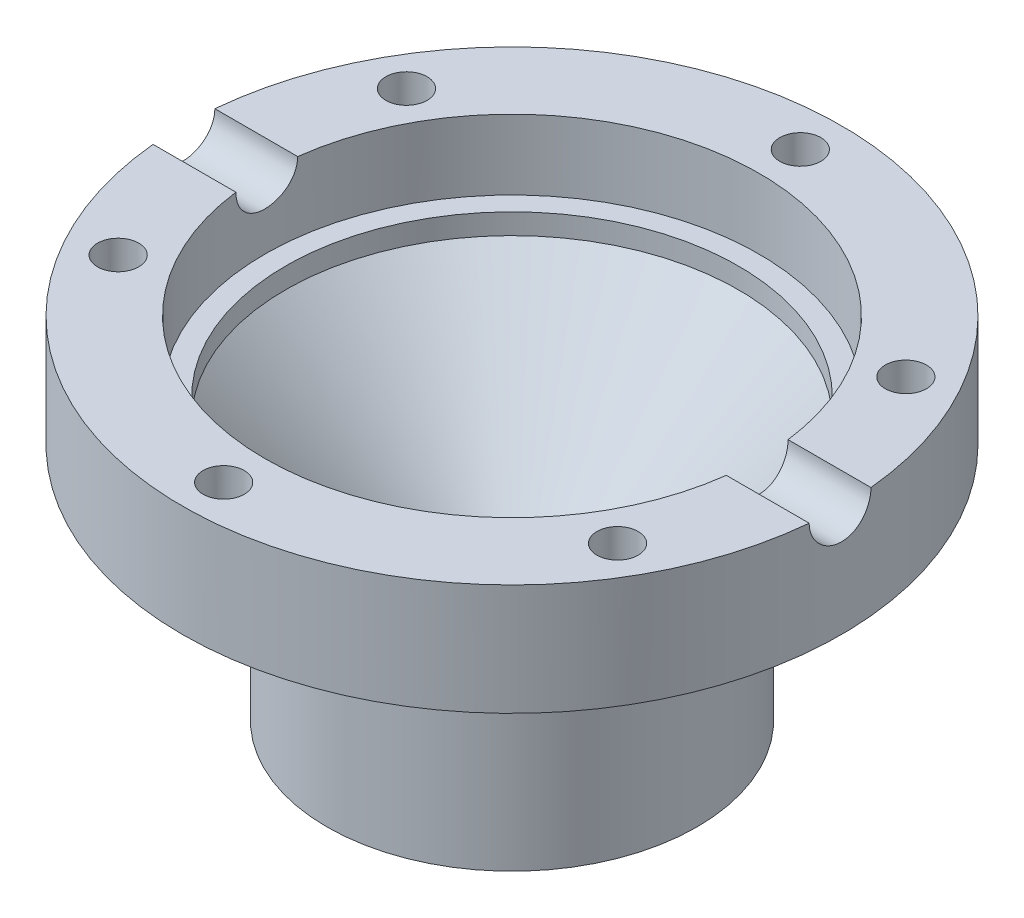
ISO-10303-21;
HEADER;
FILE_DESCRIPTION(('STEP AP214'),'2;1');
FILE_NAME('part.step','',(''),(''),'','','');
FILE_SCHEMA(('AUTOMOTIVE_DESIGN { 1 0 10303 214 1 1 1 1 }'));
ENDSEC;
DATA;
#1=APPLICATION_CONTEXT('core data for automotive mechanical design processes');
#2=APPLICATION_PROTOCOL_DEFINITION('international standard','automotive_design',2000,#1);
#3=PRODUCT_CONTEXT('',#1,'mechanical');
#4=PRODUCT('Part','Part','',(#3));
#5=PRODUCT_RELATED_PRODUCT_CATEGORY('part','',(#4));
#6=PRODUCT_DEFINITION_FORMATION('','',#4);
#7=PRODUCT_DEFINITION_CONTEXT('part definition',#1,'design');
#8=PRODUCT_DEFINITION('design','',#6,#7);
#9=PRODUCT_DEFINITION_SHAPE('','',#8);
#10=(LENGTH_UNIT() NAMED_UNIT(*) SI_UNIT(.MILLI.,.METRE.));
#11=(NAMED_UNIT(*) PLANE_ANGLE_UNIT() SI_UNIT($,.RADIAN.));
#12=(NAMED_UNIT(*) SI_UNIT($,.STERADIAN.) SOLID_ANGLE_UNIT());
#13=UNCERTAINTY_MEASURE_WITH_UNIT(LENGTH_MEASURE(1.E-05),#10,'distance_accuracy_value','');
#14=(GEOMETRIC_REPRESENTATION_CONTEXT(3) GLOBAL_UNCERTAINTY_ASSIGNED_CONTEXT((#13)) GLOBAL_UNIT_ASSIGNED_CONTEXT((#10,
#11,#12)) REPRESENTATION_CONTEXT('',''));
#15=CARTESIAN_POINT('',(0.,0.,0.));
#16=DIRECTION('',(0.,0.,1.));
#17=DIRECTION('',(1.,0.,0.));
#18=AXIS2_PLACEMENT_3D('',#15,#16,#17);
#19=CARTESIAN_POINT('',(0.,21.59,0.));
#20=DIRECTION('',(0.,1.,0.));
#21=DIRECTION('',(0.,0.,1.));
#22=AXIS2_PLACEMENT_3D('',#19,#20,#21);
#23=PLANE('',#22);
#24=DIRECTION('',(1.,0.,0.));
#25=VECTOR('',#24,1.);
#26=CARTESIAN_POINT('',(-20.32,21.59,1.905));
#27=LINE('',#26,#25);
#28=CARTESIAN_POINT('',(-20.230506049034,21.59,1.905));
#29=VERTEX_POINT('',#28);
#30=CARTESIAN_POINT('',(-15.1204687427341,21.59,1.905));
#31=VERTEX_POINT('',#30);
#32=EDGE_CURVE('E55',#29,#31,#27,.T.);
#33=ORIENTED_EDGE('',*,*,#32,.F.);
#34=CARTESIAN_POINT('',(0.,21.59,0.));
#35=DIRECTION('',(0.,1.,0.));
#36=DIRECTION('',(0.,0.,1.));
#37=AXIS2_PLACEMENT_3D('',#34,#35,#36);
#38=CIRCLE('',#37,20.32);
#39=CARTESIAN_POINT('',(20.230506049034,21.59,1.905));
#40=VERTEX_POINT('',#39);
#41=EDGE_CURVE('E99',#29,#40,#38,.T.);
#42=ORIENTED_EDGE('',*,*,#41,.T.);
#43=CARTESIAN_POINT('',(15.1204687427341,21.59,1.905));
#44=VERTEX_POINT('',#43);
#45=EDGE_CURVE('E137',#44,#40,#27,.T.);
#46=ORIENTED_EDGE('',*,*,#45,.F.);
#47=CARTESIAN_POINT('',(0.,21.59,0.));
#48=DIRECTION('',(0.,1.,0.));
#49=DIRECTION('',(0.,0.,1.));
#50=AXIS2_PLACEMENT_3D('',#47,#48,#49);
#51=CIRCLE('',#50,15.24);
#52=EDGE_CURVE('E96',#31,#44,#51,.T.);
#53=ORIENTED_EDGE('',*,*,#52,.F.);
#54=EDGE_LOOP('',(#33,#42,#46,#53));
#55=FACE_BOUND('',#54,.T.);
#56=CARTESIAN_POINT('',(15.3979316792873,21.59,8.89000000000007));
#57=DIRECTION('',(0.,1.,0.));
#58=DIRECTION('',(-0.866025403784436,0.,-0.500000000000004));
#59=AXIS2_PLACEMENT_3D('',#56,#57,#58);
#60=CIRCLE('',#59,1.27);
#61=CARTESIAN_POINT('',(14.298079416481,21.59,8.25500000000007));
#62=VERTEX_POINT('',#61);
#63=EDGE_CURVE('E159',#62,#62,#60,.T.);
#64=ORIENTED_EDGE('',*,*,#63,.F.);
#65=EDGE_LOOP('',(#64));
#66=FACE_BOUND('',#65,.T.);
#67=CARTESIAN_POINT('',(0.,21.59,17.78));
#68=DIRECTION('',(0.,1.,0.));
#69=DIRECTION('',(0.,0.,-1.));
#70=AXIS2_PLACEMENT_3D('',#67,#68,#69);
#71=CIRCLE('',#70,1.27);
#72=CARTESIAN_POINT('',(0.,21.59,16.51));
#73=VERTEX_POINT('',#72);
#74=EDGE_CURVE('E167',#73,#73,#71,.T.);
#75=ORIENTED_EDGE('',*,*,#74,.F.);
#76=EDGE_LOOP('',(#75));
#77=FACE_BOUND('',#76,.T.);
#78=CARTESIAN_POINT('',(-15.3979316792874,21.59,8.88999999999985));
#79=DIRECTION('',(0.,1.,0.));
#80=DIRECTION('',(0.866025403784443,0.,-0.499999999999992));
#81=AXIS2_PLACEMENT_3D('',#78,#79,#80);
#82=CIRCLE('',#81,1.27);
#83=CARTESIAN_POINT('',(-14.2980794164812,21.59,8.25499999999986));
#84=VERTEX_POINT('',#83);
#85=EDGE_CURVE('E173',#84,#84,#82,.T.);
#86=ORIENTED_EDGE('',*,*,#85,.F.);
#87=EDGE_LOOP('',(#86));
#88=FACE_BOUND('',#87,.T.);
#89=ADVANCED_FACE('F33',(#55,#66,#77,#88),#23,.T.);
#90=CARTESIAN_POINT('',(0.,0.,0.));
#91=DIRECTION('',(0.,1.,0.));
#92=DIRECTION('',(0.,0.,1.));
#93=AXIS2_PLACEMENT_3D('',#90,#91,#92);
#94=PLANE('',#93);
#95=CARTESIAN_POINT('',(0.,0.,0.));
#96=DIRECTION('',(0.,-1.,0.));
#97=DIRECTION('',(0.,0.,-1.));
#98=AXIS2_PLACEMENT_3D('',#95,#96,#97);
#99=CIRCLE('',#98,4.699);
#100=CARTESIAN_POINT('',(0.,0.,-4.699));
#101=VERTEX_POINT('',#100);
#102=EDGE_CURVE('E155',#101,#101,#99,.T.);
#103=ORIENTED_EDGE('',*,*,#102,.F.);
#104=EDGE_LOOP('',(#103));
#105=FACE_BOUND('',#104,.T.);
#106=CARTESIAN_POINT('',(0.,0.,0.));
#107=DIRECTION('',(0.,1.,0.));
#108=DIRECTION('',(0.,0.,1.));
#109=AXIS2_PLACEMENT_3D('',#106,#107,#108);
#110=CIRCLE('',#109,11.40968);
#111=CARTESIAN_POINT('',(0.,0.,11.40968));
#112=VERTEX_POINT('',#111);
#113=EDGE_CURVE('E146',#112,#112,#110,.T.);
#114=ORIENTED_EDGE('',*,*,#113,.F.);
#115=EDGE_LOOP('',(#114));
#116=FACE_BOUND('',#115,.T.);
#117=ADVANCED_FACE('F220',(#105,#116),#94,.F.);
#118=CARTESIAN_POINT('',(0.,21.59,0.));
#119=DIRECTION('',(0.,-1.,0.));
#120=DIRECTION('',(0.,0.,-1.));
#121=AXIS2_PLACEMENT_3D('',#118,#119,#120);
#122=CYLINDRICAL_SURFACE('',#121,20.32);
#123=CARTESIAN_POINT('',(0.,14.732,0.));
#124=DIRECTION('',(0.,1.,0.));
#125=DIRECTION('',(0.,0.,1.));
#126=AXIS2_PLACEMENT_3D('',#123,#124,#125);
#127=CIRCLE('',#126,20.32);
#128=CARTESIAN_POINT('',(0.,14.732,20.32));
#129=VERTEX_POINT('',#128);
#130=EDGE_CURVE('E101',#129,#129,#127,.T.);
#131=ORIENTED_EDGE('',*,*,#130,.T.);
#132=EDGE_LOOP('',(#131));
#133=FACE_BOUND('',#132,.T.);
#134=CARTESIAN_POINT('',(20.230506049034,21.59,-1.905));
#135=VERTEX_POINT('',#134);
#136=CARTESIAN_POINT('',(-20.230506049034,21.59,-1.905));
#137=VERTEX_POINT('',#136);
#138=EDGE_CURVE('E86',#135,#137,#38,.T.);
#139=ORIENTED_EDGE('',*,*,#138,.F.);
#140=CARTESIAN_POINT('',(20.230506049034,21.59,-1.905));
#141=CARTESIAN_POINT('',(20.2305048419639,21.536529886188,-1.9049997844618));
#142=CARTESIAN_POINT('',(20.2307183050446,21.4830855041032,-1.9027473617315));
#143=CARTESIAN_POINT('',(20.231561824142,21.3765814709534,-1.89376245028911));
#144=CARTESIAN_POINT('',(20.232191853417,21.3235217954131,-1.88703024915808));
#145=CARTESIAN_POINT('',(20.2346847598082,21.165596507574,-1.86018187930186));
#146=CARTESIAN_POINT('',(20.2371505441765,21.0617924238009,-1.83341374337296));
#147=CARTESIAN_POINT('',(20.2434143344982,20.8601801826428,-1.76289924237057));
#148=CARTESIAN_POINT('',(20.2472128561946,20.7623743637062,-1.71914630381519));
#149=CARTESIAN_POINT('',(20.2557124201876,20.5754921060027,-1.61591652294307));
#150=CARTESIAN_POINT('',(20.2604133454438,20.4864145374543,-1.55644171935339));
#151=CARTESIAN_POINT('',(20.2702044665111,20.3192475841751,-1.42325956423772));
#152=CARTESIAN_POINT('',(20.275295701896,20.2411892368867,-1.34951334578633));
#153=CARTESIAN_POINT('',(20.2852849434553,20.0985286835315,-1.18995465134418));
#154=CARTESIAN_POINT('',(20.2901829201158,20.0339285263536,-1.10414034142077));
#155=CARTESIAN_POINT('',(20.2992435007207,19.9199224956263,-0.922695322511813));
#156=CARTESIAN_POINT('',(20.3034047538332,19.8705444124154,-0.82704707951139));
#157=CARTESIAN_POINT('',(20.3105112772975,19.7885643113934,-0.628777299116423));
#158=CARTESIAN_POINT('',(20.3134566474185,19.7559609170826,-0.526156334673046));
#159=CARTESIAN_POINT('',(20.3177924388191,19.708544192658,-0.317169118568316));
#160=CARTESIAN_POINT('',(20.3191874090494,19.6936788088358,-0.21081477315429));
#161=CARTESIAN_POINT('',(20.320280691444,19.6819989793944,0.00289048637267596));
#162=CARTESIAN_POINT('',(20.3199790011529,19.6851845598983,0.110241401927612));
#163=CARTESIAN_POINT('',(20.3177166277443,19.7094744976171,0.322533435230876));
#164=CARTESIAN_POINT('',(20.3157611751202,19.7305223610124,0.427481080398319));
#165=CARTESIAN_POINT('',(20.310417139208,19.7898513703165,0.632347006443153));
#166=CARTESIAN_POINT('',(20.3070285462902,19.8281326320223,0.73226525352129));
#167=CARTESIAN_POINT('',(20.2991902282816,19.9209049459651,0.924417241106757));
#168=CARTESIAN_POINT('',(20.2947388396777,19.9754214434005,1.01663862581396));
#169=CARTESIAN_POINT('',(20.2852749987263,20.0990958055314,1.19063953581827));
#170=CARTESIAN_POINT('',(20.2802625572437,20.1682533867244,1.2724192632531));
#171=CARTESIAN_POINT('',(20.2702171335259,20.3195536154736,1.42354012541889));
#172=CARTESIAN_POINT('',(20.2651841441853,20.4017435671613,1.49283390216885));
#173=CARTESIAN_POINT('',(20.2556819366046,20.5766461295877,1.61666960669434));
#174=CARTESIAN_POINT('',(20.2512128909555,20.6693619452808,1.67120702420478));
#175=CARTESIAN_POINT('',(20.2433434763916,20.8627316881732,1.76397923375594));
#176=CARTESIAN_POINT('',(20.2399439313991,20.9633916610879,1.80220146494809));
#177=CARTESIAN_POINT('',(20.2346109412246,21.1696641572812,1.86113143952841));
#178=CARTESIAN_POINT('',(20.2326752763653,21.2752689235142,1.88186570539399));
#179=CARTESIAN_POINT('',(20.2312213758828,21.416340356759,1.89738948822792));
#180=CARTESIAN_POINT('',(20.230953293904,21.4510410774768,1.90024485867607));
#181=CARTESIAN_POINT('',(20.2305958533842,21.520489726054,1.90404753411258));
#182=CARTESIAN_POINT('',(20.2305061969765,21.5552374781665,1.90499801916789));
#183=CARTESIAN_POINT('',(20.230506049034,21.59,1.905));
#184=B_SPLINE_CURVE_WITH_KNOTS('',3,(#140,#141,#142,#143,#144,#145,#146,#147,#148,#149,#150,
#151,#152,#153,#154,#155,#156,#157,#158,#159,#160,#161,#162,#163,#164,#165,#166,#167,#168,#169,
#170,#171,#172,#173,#174,#175,#176,#177,#178,#179,#180,#181,#182,#183),.UNSPECIFIED.,.F.,.F.,(4,
2,2,2,2,2,2,2,2,2,2,2,2,2,2,2,2,2,2,2,2,4),(0.,0.16031144516378,0.320612600067446,
0.640645643669809,0.960802670588063,1.28091820160995,1.60191812979215,1.92296689168407,
2.24459835512714,2.56620342187747,2.88686237159023,3.20752178535595,3.52717079906967,
3.846821960646,4.16697676631038,4.48712537322918,4.80846382175077,5.1299003763531,
5.45158395635061,5.77277878504201,5.8771981883666,5.98144312543351),.UNSPECIFIED.);
#185=EDGE_CURVE('E130',#135,#40,#184,.T.);
#186=ORIENTED_EDGE('',*,*,#185,.T.);
#187=ORIENTED_EDGE('',*,*,#41,.F.);
#188=CARTESIAN_POINT('',(-20.230506049034,21.59,1.905));
#189=CARTESIAN_POINT('',(-20.2305048419639,21.536529886188,1.9049997844618));
#190=CARTESIAN_POINT('',(-20.2307183050446,21.4830855041032,1.9027473617315));
#191=CARTESIAN_POINT('',(-20.231561824142,21.3765814709534,1.89376245028911));
#192=CARTESIAN_POINT('',(-20.232191853417,21.3235217954131,1.88703024915808));
#193=CARTESIAN_POINT('',(-20.2346847598082,21.165596507574,1.86018187930186));
#194=CARTESIAN_POINT('',(-20.2371505441765,21.0617924238009,1.83341374337296));
#195=CARTESIAN_POINT('',(-20.2434143344982,20.8601801826428,1.76289924237057));
#196=CARTESIAN_POINT('',(-20.2472128561946,20.7623743637062,1.71914630381519));
#197=CARTESIAN_POINT('',(-20.2557124201876,20.5754921060027,1.61591652294307));
#198=CARTESIAN_POINT('',(-20.2604133454438,20.4864145374543,1.55644171935339));
#199=CARTESIAN_POINT('',(-20.2702044665111,20.3192475841751,1.42325956423772));
#200=CARTESIAN_POINT('',(-20.275295701896,20.2411892368867,1.34951334578633));
#201=CARTESIAN_POINT('',(-20.2852849434553,20.0985286835315,1.18995465134418));
#202=CARTESIAN_POINT('',(-20.2901829201158,20.0339285263536,1.10414034142077));
#203=CARTESIAN_POINT('',(-20.2992435007207,19.9199224956263,0.922695322511813));
#204=CARTESIAN_POINT('',(-20.3034047538332,19.8705444124154,0.82704707951139));
#205=CARTESIAN_POINT('',(-20.3105112772975,19.7885643113934,0.628777299116423));
#206=CARTESIAN_POINT('',(-20.3134566474185,19.7559609170826,0.526156334673046));
#207=CARTESIAN_POINT('',(-20.3177924388191,19.708544192658,0.317169118568316));
#208=CARTESIAN_POINT('',(-20.3191874090494,19.6936788088358,0.21081477315429));
#209=CARTESIAN_POINT('',(-20.320280691444,19.6819989793944,-0.00289048637267596));
#210=CARTESIAN_POINT('',(-20.3199790011529,19.6851845598983,-0.110241401927612));
#211=CARTESIAN_POINT('',(-20.3177166277443,19.7094744976171,-0.322533435230876));
#212=CARTESIAN_POINT('',(-20.3157611751202,19.7305223610124,-0.427481080398319));
#213=CARTESIAN_POINT('',(-20.310417139208,19.7898513703165,-0.632347006443153));
#214=CARTESIAN_POINT('',(-20.3070285462902,19.8281326320223,-0.73226525352129));
#215=CARTESIAN_POINT('',(-20.2991902282816,19.9209049459651,-0.924417241106757));
#216=CARTESIAN_POINT('',(-20.2947388396777,19.9754214434005,-1.01663862581396));
#217=CARTESIAN_POINT('',(-20.2852749987263,20.0990958055314,-1.19063953581827));
#218=CARTESIAN_POINT('',(-20.2802625572437,20.1682533867244,-1.2724192632531));
#219=CARTESIAN_POINT('',(-20.2702171335259,20.3195536154736,-1.42354012541889));
#220=CARTESIAN_POINT('',(-20.2651841441853,20.4017435671613,-1.49283390216885));
#221=CARTESIAN_POINT('',(-20.2556819366046,20.5766461295877,-1.61666960669434));
#222=CARTESIAN_POINT('',(-20.2512128909555,20.6693619452808,-1.67120702420478));
#223=CARTESIAN_POINT('',(-20.2433434763916,20.8627316881732,-1.76397923375594));
#224=CARTESIAN_POINT('',(-20.2399439313991,20.9633916610879,-1.80220146494809));
#225=CARTESIAN_POINT('',(-20.2346109412246,21.1696641572812,-1.86113143952841));
#226=CARTESIAN_POINT('',(-20.2326752763653,21.2752689235142,-1.88186570539399));
#227=CARTESIAN_POINT('',(-20.2312213758828,21.416340356759,-1.89738948822792));
#228=CARTESIAN_POINT('',(-20.230953293904,21.4510410774768,-1.90024485867607));
#229=CARTESIAN_POINT('',(-20.2305958533842,21.520489726054,-1.90404753411258));
#230=CARTESIAN_POINT('',(-20.2305061969765,21.5552374781665,-1.90499801916789));
#231=CARTESIAN_POINT('',(-20.230506049034,21.59,-1.905));
#232=B_SPLINE_CURVE_WITH_KNOTS('',3,(#188,#189,#190,#191,#192,#193,#194,#195,#196,#197,#198,
#199,#200,#201,#202,#203,#204,#205,#206,#207,#208,#209,#210,#211,#212,#213,#214,#215,#216,#217,
#218,#219,#220,#221,#222,#223,#224,#225,#226,#227,#228,#229,#230,#231),.UNSPECIFIED.,.F.,.F.,(4,
2,2,2,2,2,2,2,2,2,2,2,2,2,2,2,2,2,2,2,2,4),(0.,0.16031144516378,0.320612600067446,
0.640645643669809,0.960802670588063,1.28091820160995,1.60191812979215,1.92296689168407,
2.24459835512714,2.56620342187747,2.88686237159023,3.20752178535595,3.52717079906967,
3.846821960646,4.16697676631038,4.48712537322918,4.80846382175077,5.1299003763531,
5.45158395635061,5.77277878504201,5.8771981883666,5.98144312543351),.UNSPECIFIED.);
#233=EDGE_CURVE('E124',#29,#137,#232,.T.);
#234=ORIENTED_EDGE('',*,*,#233,.T.);
#235=EDGE_LOOP('',(#139,#186,#187,#234));
#236=FACE_BOUND('',#235,.T.);
#237=ADVANCED_FACE('F35',(#133,#236),#122,.T.);
#238=DIRECTION('',(1.,0.,0.));
#239=VECTOR('',#238,1.);
#240=CARTESIAN_POINT('',(-20.32,21.59,-1.905));
#241=LINE('',#240,#239);
#242=CARTESIAN_POINT('',(15.1204687427341,21.59,-1.905));
#243=VERTEX_POINT('',#242);
#244=EDGE_CURVE('E63',#135,#243,#241,.F.);
#245=ORIENTED_EDGE('',*,*,#244,.F.);
#246=ORIENTED_EDGE('',*,*,#138,.T.);
#247=CARTESIAN_POINT('',(-15.1204687427341,21.59,-1.905));
#248=VERTEX_POINT('',#247);
#249=EDGE_CURVE('E80',#248,#137,#241,.F.);
#250=ORIENTED_EDGE('',*,*,#249,.F.);
#251=EDGE_CURVE('E91',#243,#248,#51,.T.);
#252=ORIENTED_EDGE('',*,*,#251,.F.);
#253=EDGE_LOOP('',(#245,#246,#250,#252));
#254=FACE_BOUND('',#253,.T.);
#255=CARTESIAN_POINT('',(-15.3979316792872,21.59,-8.89000000000018));
#256=DIRECTION('',(0.,1.,0.));
#257=DIRECTION('',(0.866025403784433,0.,0.50000000000001));
#258=AXIS2_PLACEMENT_3D('',#255,#256,#257);
#259=CIRCLE('',#258,1.27);
#260=CARTESIAN_POINT('',(-14.298079416481,21.59,-8.25500000000017));
#261=VERTEX_POINT('',#260);
#262=EDGE_CURVE('E158',#261,#261,#259,.T.);
#263=ORIENTED_EDGE('',*,*,#262,.F.);
#264=EDGE_LOOP('',(#263));
#265=FACE_BOUND('',#264,.T.);
#266=CARTESIAN_POINT('',(15.3979316792873,21.59,-8.88999999999996));
#267=DIRECTION('',(0.,1.,0.));
#268=DIRECTION('',(-0.86602540378444,0.,0.499999999999998));
#269=AXIS2_PLACEMENT_3D('',#266,#267,#268);
#270=CIRCLE('',#269,1.27);
#271=CARTESIAN_POINT('',(14.2980794164811,21.59,-8.25499999999996));
#272=VERTEX_POINT('',#271);
#273=EDGE_CURVE('E166',#272,#272,#270,.T.);
#274=ORIENTED_EDGE('',*,*,#273,.F.);
#275=EDGE_LOOP('',(#274));
#276=FACE_BOUND('',#275,.T.);
#277=CARTESIAN_POINT('',(0.,21.59,-17.78));
#278=DIRECTION('',(0.,1.,0.));
#279=DIRECTION('',(0.,0.,1.));
#280=AXIS2_PLACEMENT_3D('',#277,#278,#279);
#281=CIRCLE('',#280,1.27);
#282=CARTESIAN_POINT('',(0.,21.59,-16.51));
#283=VERTEX_POINT('',#282);
#284=EDGE_CURVE('E188',#283,#283,#281,.T.);
#285=ORIENTED_EDGE('',*,*,#284,.F.);
#286=EDGE_LOOP('',(#285));
#287=FACE_BOUND('',#286,.T.);
#288=ADVANCED_FACE('F89',(#254,#265,#276,#287),#23,.T.);
#289=CARTESIAN_POINT('',(0.,17.272,0.));
#290=DIRECTION('',(0.,-1.,0.));
#291=DIRECTION('',(0.,0.,-1.));
#292=AXIS2_PLACEMENT_3D('',#289,#290,#291);
#293=PLANE('',#292);
#294=CARTESIAN_POINT('',(0.,17.272,0.));
#295=DIRECTION('',(0.,1.,0.));
#296=DIRECTION('',(0.,0.,1.));
#297=AXIS2_PLACEMENT_3D('',#294,#295,#296);
#298=CIRCLE('',#297,13.97);
#299=CARTESIAN_POINT('',(0.,17.272,13.97));
#300=VERTEX_POINT('',#299);
#301=EDGE_CURVE('E143',#300,#300,#298,.T.);
#302=ORIENTED_EDGE('',*,*,#301,.F.);
#303=EDGE_LOOP('',(#302));
#304=FACE_BOUND('',#303,.T.);
#305=CARTESIAN_POINT('',(0.,17.272,0.));
#306=DIRECTION('',(0.,1.,0.));
#307=DIRECTION('',(0.,0.,1.));
#308=AXIS2_PLACEMENT_3D('',#305,#306,#307);
#309=CIRCLE('',#308,15.24);
#310=CARTESIAN_POINT('',(0.,17.272,15.24));
#311=VERTEX_POINT('',#310);
#312=EDGE_CURVE('E95',#311,#311,#309,.T.);
#313=ORIENTED_EDGE('',*,*,#312,.T.);
#314=EDGE_LOOP('',(#313));
#315=FACE_BOUND('',#314,.T.);
#316=ADVANCED_FACE('F231',(#304,#315),#293,.F.);
#317=CARTESIAN_POINT('',(0.,55.,0.));
#318=DIRECTION('',(0.,1.,0.));
#319=DIRECTION('',(0.,0.,1.));
#320=AXIS2_PLACEMENT_3D('',#317,#318,#319);
#321=CYLINDRICAL_SURFACE('',#320,15.24);
#322=ORIENTED_EDGE('',*,*,#312,.F.);
#323=EDGE_LOOP('',(#322));
#324=FACE_BOUND('',#323,.T.);
#325=ORIENTED_EDGE('',*,*,#52,.T.);
#326=CARTESIAN_POINT('',(15.1204687427341,21.59,1.905));
#327=CARTESIAN_POINT('',(15.1204671133158,21.5366274694487,1.90499989360323));
#328=CARTESIAN_POINT('',(15.1207516960141,21.4832807142874,1.90275557371027));
#329=CARTESIAN_POINT('',(15.1218761272803,21.3769730548197,1.89380370376915));
#330=CARTESIAN_POINT('',(15.1227159330873,21.3240121211164,1.88709649743353));
#331=CARTESIAN_POINT('',(15.1260382733685,21.1663984931321,1.86035199624362));
#332=CARTESIAN_POINT('',(15.1293238596181,21.0628080964398,1.83369159466203));
#333=CARTESIAN_POINT('',(15.1376673852147,20.861620704,1.7634796516013));
#334=CARTESIAN_POINT('',(15.1427259043614,20.7640256811972,1.7199225839306));
#335=CARTESIAN_POINT('',(15.1540430006239,20.5775222303475,1.617171049677));
#336=CARTESIAN_POINT('',(15.1603014840875,20.4886131252186,1.55797780329504));
#337=CARTESIAN_POINT('',(15.1733517718042,20.3215303034019,1.42528888368464));
#338=CARTESIAN_POINT('',(15.1801460390645,20.2434113248636,1.35172454974885));
#339=CARTESIAN_POINT('',(15.1934810047301,20.1005844792215,1.19251997482523));
#340=CARTESIAN_POINT('',(15.2000216643625,20.0358786562646,1.10687789654226));
#341=CARTESIAN_POINT('',(15.2121372273219,19.9215278900306,0.925606187493567));
#342=CARTESIAN_POINT('',(15.2177088874507,19.8719331216397,0.829944670801982));
#343=CARTESIAN_POINT('',(15.227230921244,19.7895359420639,0.631575103477019));
#344=CARTESIAN_POINT('',(15.2311814509705,19.7567319144036,0.528867732240991));
#345=CARTESIAN_POINT('',(15.2369989700154,19.7090093270864,0.319885582650474));
#346=CARTESIAN_POINT('',(15.238876727411,19.6939983022197,0.213632223959195));
#347=CARTESIAN_POINT('',(15.2403739201908,19.6820011668644,9.64844855378771E-05));
#348=CARTESIAN_POINT('',(15.2399933897453,19.6850147836439,-0.107185880702348));
#349=CARTESIAN_POINT('',(15.2370255120095,19.7089079343474,-0.319099425091584));
#350=CARTESIAN_POINT('',(15.2344505108576,19.7296875186708,-0.423742070832128));
#351=CARTESIAN_POINT('',(15.2273969220193,19.7883664109259,-0.628042592241164));
#352=CARTESIAN_POINT('',(15.2229183084999,19.8262659511842,-0.727700400242476));
#353=CARTESIAN_POINT('',(15.2125393743087,19.9182159912448,-0.919514146212048));
#354=CARTESIAN_POINT('',(15.2066352272363,19.9723100555869,-1.01164898500401));
#355=CARTESIAN_POINT('',(15.1940661225624,20.0950796970392,-1.18556685508717));
#356=CARTESIAN_POINT('',(15.1874011621984,20.1637553270964,-1.26734984878812));
#357=CARTESIAN_POINT('',(15.1740031558885,20.3142875574399,-1.41882368657018));
#358=CARTESIAN_POINT('',(15.1672699531323,20.3962294871063,-1.48842973472849));
#359=CARTESIAN_POINT('',(15.1545364101041,20.5707090315982,-1.61293430049883));
#360=CARTESIAN_POINT('',(15.1485362879528,20.6632497842065,-1.66782844650226));
#361=CARTESIAN_POINT('',(15.1379475348401,20.8563881000082,-1.76135479044095));
#362=CARTESIAN_POINT('',(15.1333603353297,20.9569937046552,-1.79997051098206));
#363=CARTESIAN_POINT('',(15.1261400717429,21.1632586727981,-1.85967907137902));
#364=CARTESIAN_POINT('',(15.1235040655381,21.2689101706377,-1.88079829927213));
#365=CARTESIAN_POINT('',(15.1214844556447,21.4111015845191,-1.89692242472637));
#366=CARTESIAN_POINT('',(15.1211038339826,21.4468447887333,-1.8999529522091));
#367=CARTESIAN_POINT('',(15.1205962736803,21.5183869490137,-1.90398903079193));
#368=CARTESIAN_POINT('',(15.120468909919,21.5541857105297,-1.90499797536143));
#369=CARTESIAN_POINT('',(15.1204687427341,21.59,-1.905));
#370=B_SPLINE_CURVE_WITH_KNOTS('',3,(#326,#327,#328,#329,#330,#331,#332,#333,#334,#335,#336,
#337,#338,#339,#340,#341,#342,#343,#344,#345,#346,#347,#348,#349,#350,#351,#352,#353,#354,#355,
#356,#357,#358,#359,#360,#361,#362,#363,#364,#365,#366,#367,#368,#369),.UNSPECIFIED.,.F.,.F.,(4,
2,2,2,2,2,2,2,2,2,2,2,2,2,2,2,2,2,2,2,2,4),(0.,0.160018584498597,0.320024846472053,
0.639424691784234,0.958929087597169,1.27840855759819,1.59945347806483,1.92054728943376,
2.24269592800397,2.56481354689786,2.88524976829882,3.20568114116947,3.52432157201225,
3.84296632709827,4.16247608380281,4.48198700069738,4.80364123975377,5.12539095193678,
5.44746556901605,5.7690535474673,5.87663169144012,5.98402910079675),.UNSPECIFIED.);
#371=EDGE_CURVE('E11',#44,#243,#370,.T.);
#372=ORIENTED_EDGE('',*,*,#371,.T.);
#373=ORIENTED_EDGE('',*,*,#251,.T.);
#374=CARTESIAN_POINT('',(-15.1204687427341,21.59,-1.905));
#375=CARTESIAN_POINT('',(-15.1204671133158,21.5366274694487,-1.90499989360323));
#376=CARTESIAN_POINT('',(-15.1207516960141,21.4832807142874,-1.90275557371027));
#377=CARTESIAN_POINT('',(-15.1218761272803,21.3769730548197,-1.89380370376915));
#378=CARTESIAN_POINT('',(-15.1227159330873,21.3240121211164,-1.88709649743353));
#379=CARTESIAN_POINT('',(-15.1260382733685,21.1663984931321,-1.86035199624362));
#380=CARTESIAN_POINT('',(-15.1293238596181,21.0628080964398,-1.83369159466203));
#381=CARTESIAN_POINT('',(-15.1376673852147,20.861620704,-1.7634796516013));
#382=CARTESIAN_POINT('',(-15.1427259043614,20.7640256811972,-1.7199225839306));
#383=CARTESIAN_POINT('',(-15.1540430006239,20.5775222303475,-1.617171049677));
#384=CARTESIAN_POINT('',(-15.1603014840875,20.4886131252186,-1.55797780329504));
#385=CARTESIAN_POINT('',(-15.1733517718042,20.3215303034019,-1.42528888368464));
#386=CARTESIAN_POINT('',(-15.1801460390645,20.2434113248636,-1.35172454974885));
#387=CARTESIAN_POINT('',(-15.1934810047301,20.1005844792215,-1.19251997482523));
#388=CARTESIAN_POINT('',(-15.2000216643625,20.0358786562646,-1.10687789654226));
#389=CARTESIAN_POINT('',(-15.2121372273219,19.9215278900306,-0.925606187493567));
#390=CARTESIAN_POINT('',(-15.2177088874507,19.8719331216397,-0.829944670801982));
#391=CARTESIAN_POINT('',(-15.227230921244,19.7895359420639,-0.631575103477019));
#392=CARTESIAN_POINT('',(-15.2311814509705,19.7567319144036,-0.528867732240991));
#393=CARTESIAN_POINT('',(-15.2369989700154,19.7090093270864,-0.319885582650474));
#394=CARTESIAN_POINT('',(-15.238876727411,19.6939983022197,-0.213632223959195));
#395=CARTESIAN_POINT('',(-15.2403739201908,19.6820011668644,-9.64844855378771E-05));
#396=CARTESIAN_POINT('',(-15.2399933897453,19.6850147836439,0.107185880702348));
#397=CARTESIAN_POINT('',(-15.2370255120095,19.7089079343474,0.319099425091584));
#398=CARTESIAN_POINT('',(-15.2344505108576,19.7296875186708,0.423742070832128));
#399=CARTESIAN_POINT('',(-15.2273969220193,19.7883664109259,0.628042592241164));
#400=CARTESIAN_POINT('',(-15.2229183084999,19.8262659511842,0.727700400242476));
#401=CARTESIAN_POINT('',(-15.2125393743087,19.9182159912448,0.919514146212048));
#402=CARTESIAN_POINT('',(-15.2066352272363,19.9723100555869,1.01164898500401));
#403=CARTESIAN_POINT('',(-15.1940661225624,20.0950796970392,1.18556685508717));
#404=CARTESIAN_POINT('',(-15.1874011621984,20.1637553270964,1.26734984878812));
#405=CARTESIAN_POINT('',(-15.1740031558885,20.3142875574399,1.41882368657018));
#406=CARTESIAN_POINT('',(-15.1672699531323,20.3962294871063,1.48842973472849));
#407=CARTESIAN_POINT('',(-15.1545364101041,20.5707090315982,1.61293430049883));
#408=CARTESIAN_POINT('',(-15.1485362879528,20.6632497842065,1.66782844650226));
#409=CARTESIAN_POINT('',(-15.1379475348401,20.8563881000082,1.76135479044095));
#410=CARTESIAN_POINT('',(-15.1333603353297,20.9569937046552,1.79997051098206));
#411=CARTESIAN_POINT('',(-15.1261400717429,21.1632586727981,1.85967907137902));
#412=CARTESIAN_POINT('',(-15.1235040655381,21.2689101706377,1.88079829927213));
#413=CARTESIAN_POINT('',(-15.1214844556447,21.4111015845191,1.89692242472637));
#414=CARTESIAN_POINT('',(-15.1211038339826,21.4468447887333,1.8999529522091));
#415=CARTESIAN_POINT('',(-15.1205962736803,21.5183869490137,1.90398903079193));
#416=CARTESIAN_POINT('',(-15.120468909919,21.5541857105297,1.90499797536143));
#417=CARTESIAN_POINT('',(-15.1204687427341,21.59,1.905));
#418=B_SPLINE_CURVE_WITH_KNOTS('',3,(#374,#375,#376,#377,#378,#379,#380,#381,#382,#383,#384,
#385,#386,#387,#388,#389,#390,#391,#392,#393,#394,#395,#396,#397,#398,#399,#400,#401,#402,#403,
#404,#405,#406,#407,#408,#409,#410,#411,#412,#413,#414,#415,#416,#417),.UNSPECIFIED.,.F.,.F.,(4,
2,2,2,2,2,2,2,2,2,2,2,2,2,2,2,2,2,2,2,2,4),(0.,0.160018584498597,0.320024846472053,
0.639424691784234,0.958929087597169,1.27840855759819,1.59945347806483,1.92054728943376,
2.24269592800397,2.56481354689786,2.88524976829882,3.20568114116947,3.52432157201225,
3.84296632709827,4.16247608380281,4.48198700069738,4.80364123975377,5.12539095193678,
5.44746556901605,5.7690535474673,5.87663169144012,5.98402910079675),.UNSPECIFIED.);
#419=EDGE_CURVE('E48',#248,#31,#418,.T.);
#420=ORIENTED_EDGE('',*,*,#419,.T.);
#421=EDGE_LOOP('',(#325,#372,#373,#420));
#422=FACE_BOUND('',#421,.T.);
#423=ADVANCED_FACE('F94',(#324,#422),#321,.F.);
#424=CARTESIAN_POINT('',(-20.32,14.732,0.));
#425=DIRECTION('',(0.,1.,0.));
#426=DIRECTION('',(0.,0.,1.));
#427=AXIS2_PLACEMENT_3D('',#424,#425,#426);
#428=PLANE('',#427);
#429=CARTESIAN_POINT('',(-15.3979316792872,14.732,-8.89000000000018));
#430=DIRECTION('',(0.,1.,0.));
#431=DIRECTION('',(0.,0.,1.));
#432=AXIS2_PLACEMENT_3D('',#429,#430,#431);
#433=CIRCLE('',#432,1.27);
#434=CARTESIAN_POINT('',(-15.3979316792872,14.732,-7.62000000000018));
#435=VERTEX_POINT('',#434);
#436=EDGE_CURVE('E176',#435,#435,#433,.F.);
#437=ORIENTED_EDGE('',*,*,#436,.F.);
#438=EDGE_LOOP('',(#437));
#439=FACE_BOUND('',#438,.T.);
#440=CARTESIAN_POINT('',(-15.3979316792874,14.732,8.88999999999985));
#441=DIRECTION('',(0.,1.,0.));
#442=DIRECTION('',(0.,0.,1.));
#443=AXIS2_PLACEMENT_3D('',#440,#441,#442);
#444=CIRCLE('',#443,1.27);
#445=CARTESIAN_POINT('',(-15.3979316792874,14.732,10.1599999999999));
#446=VERTEX_POINT('',#445);
#447=EDGE_CURVE('E170',#446,#446,#444,.F.);
#448=ORIENTED_EDGE('',*,*,#447,.F.);
#449=EDGE_LOOP('',(#448));
#450=FACE_BOUND('',#449,.T.);
#451=CARTESIAN_POINT('',(0.,14.732,17.78));
#452=DIRECTION('',(0.,1.,0.));
#453=DIRECTION('',(0.,0.,1.));
#454=AXIS2_PLACEMENT_3D('',#451,#452,#453);
#455=CIRCLE('',#454,1.27);
#456=CARTESIAN_POINT('',(0.,14.732,19.05));
#457=VERTEX_POINT('',#456);
#458=EDGE_CURVE('E163',#457,#457,#455,.F.);
#459=ORIENTED_EDGE('',*,*,#458,.F.);
#460=EDGE_LOOP('',(#459));
#461=FACE_BOUND('',#460,.T.);
#462=CARTESIAN_POINT('',(15.3979316792873,14.732,8.89000000000007));
#463=DIRECTION('',(0.,1.,0.));
#464=DIRECTION('',(0.,0.,1.));
#465=AXIS2_PLACEMENT_3D('',#462,#463,#464);
#466=CIRCLE('',#465,1.27);
#467=CARTESIAN_POINT('',(15.3979316792873,14.732,10.1600000000001));
#468=VERTEX_POINT('',#467);
#469=EDGE_CURVE('E162',#468,#468,#466,.F.);
#470=ORIENTED_EDGE('',*,*,#469,.F.);
#471=EDGE_LOOP('',(#470));
#472=FACE_BOUND('',#471,.T.);
#473=CARTESIAN_POINT('',(15.3979316792873,14.732,-8.88999999999996));
#474=DIRECTION('',(0.,1.,0.));
#475=DIRECTION('',(0.,0.,1.));
#476=AXIS2_PLACEMENT_3D('',#473,#474,#475);
#477=CIRCLE('',#476,1.27);
#478=CARTESIAN_POINT('',(15.3979316792873,14.732,-7.61999999999996));
#479=VERTEX_POINT('',#478);
#480=EDGE_CURVE('E185',#479,#479,#477,.F.);
#481=ORIENTED_EDGE('',*,*,#480,.F.);
#482=EDGE_LOOP('',(#481));
#483=FACE_BOUND('',#482,.T.);
#484=CARTESIAN_POINT('',(0.,14.732,-17.78));
#485=DIRECTION('',(0.,1.,0.));
#486=DIRECTION('',(0.,0.,1.));
#487=AXIS2_PLACEMENT_3D('',#484,#485,#486);
#488=CIRCLE('',#487,1.27);
#489=CARTESIAN_POINT('',(0.,14.732,-16.51));
#490=VERTEX_POINT('',#489);
#491=EDGE_CURVE('E190',#490,#490,#488,.F.);
#492=ORIENTED_EDGE('',*,*,#491,.F.);
#493=EDGE_LOOP('',(#492));
#494=FACE_BOUND('',#493,.T.);
#495=ORIENTED_EDGE('',*,*,#130,.F.);
#496=EDGE_LOOP('',(#495));
#497=FACE_BOUND('',#496,.T.);
#498=CARTESIAN_POINT('',(0.,14.732,0.));
#499=DIRECTION('',(0.,1.,0.));
#500=DIRECTION('',(0.,0.,1.));
#501=AXIS2_PLACEMENT_3D('',#498,#499,#500);
#502=CIRCLE('',#501,15.24);
#503=CARTESIAN_POINT('',(0.,14.732,15.24));
#504=VERTEX_POINT('',#503);
#505=EDGE_CURVE('E152',#504,#504,#502,.T.);
#506=ORIENTED_EDGE('',*,*,#505,.T.);
#507=EDGE_LOOP('',(#506));
#508=FACE_BOUND('',#507,.T.);
#509=ADVANCED_FACE('F199',(#439,#450,#461,#472,#483,#494,#497,#508),#428,.F.);
#510=CARTESIAN_POINT('',(0.,-0.001000000000001,-17.78));
#511=DIRECTION('',(0.,1.,0.));
#512=DIRECTION('',(0.,0.,1.));
#513=AXIS2_PLACEMENT_3D('',#510,#511,#512);
#514=CYLINDRICAL_SURFACE('',#513,1.27);
#515=ORIENTED_EDGE('',*,*,#284,.T.);
#516=EDGE_LOOP('',(#515));
#517=FACE_BOUND('',#516,.T.);
#518=ORIENTED_EDGE('',*,*,#491,.T.);
#519=EDGE_LOOP('',(#518));
#520=FACE_BOUND('',#519,.T.);
#521=ADVANCED_FACE('F202',(#517,#520),#514,.F.);
#522=CARTESIAN_POINT('',(15.3979316792873,-0.001000000000001,-8.88999999999996));
#523=DIRECTION('',(0.,1.,0.));
#524=DIRECTION('',(0.,0.,1.));
#525=AXIS2_PLACEMENT_3D('',#522,#523,#524);
#526=CYLINDRICAL_SURFACE('',#525,1.27);
#527=ORIENTED_EDGE('',*,*,#273,.T.);
#528=EDGE_LOOP('',(#527));
#529=FACE_BOUND('',#528,.T.);
#530=ORIENTED_EDGE('',*,*,#480,.T.);
#531=EDGE_LOOP('',(#530));
#532=FACE_BOUND('',#531,.T.);
#533=ADVANCED_FACE('F258',(#529,#532),#526,.F.);
#534=CARTESIAN_POINT('',(15.3979316792873,-0.001000000000001,8.89000000000007));
#535=DIRECTION('',(0.,1.,0.));
#536=DIRECTION('',(0.,0.,1.));
#537=AXIS2_PLACEMENT_3D('',#534,#535,#536);
#538=CYLINDRICAL_SURFACE('',#537,1.27);
#539=ORIENTED_EDGE('',*,*,#63,.T.);
#540=EDGE_LOOP('',(#539));
#541=FACE_BOUND('',#540,.T.);
#542=ORIENTED_EDGE('',*,*,#469,.T.);
#543=EDGE_LOOP('',(#542));
#544=FACE_BOUND('',#543,.T.);
#545=ADVANCED_FACE('F254',(#541,#544),#538,.F.);
#546=CARTESIAN_POINT('',(0.,-0.001000000000001,17.78));
#547=DIRECTION('',(0.,1.,0.));
#548=DIRECTION('',(0.,0.,1.));
#549=AXIS2_PLACEMENT_3D('',#546,#547,#548);
#550=CYLINDRICAL_SURFACE('',#549,1.27);
#551=ORIENTED_EDGE('',*,*,#74,.T.);
#552=EDGE_LOOP('',(#551));
#553=FACE_BOUND('',#552,.T.);
#554=ORIENTED_EDGE('',*,*,#458,.T.);
#555=EDGE_LOOP('',(#554));
#556=FACE_BOUND('',#555,.T.);
#557=ADVANCED_FACE('F257',(#553,#556),#550,.F.);
#558=CARTESIAN_POINT('',(-15.3979316792874,-0.001000000000001,8.88999999999985));
#559=DIRECTION('',(0.,1.,0.));
#560=DIRECTION('',(0.,0.,1.));
#561=AXIS2_PLACEMENT_3D('',#558,#559,#560);
#562=CYLINDRICAL_SURFACE('',#561,1.27);
#563=ORIENTED_EDGE('',*,*,#85,.T.);
#564=EDGE_LOOP('',(#563));
#565=FACE_BOUND('',#564,.T.);
#566=ORIENTED_EDGE('',*,*,#447,.T.);
#567=EDGE_LOOP('',(#566));
#568=FACE_BOUND('',#567,.T.);
#569=ADVANCED_FACE('F262',(#565,#568),#562,.F.);
#570=CARTESIAN_POINT('',(-15.3979316792872,-0.001000000000001,-8.89000000000018));
#571=DIRECTION('',(0.,1.,0.));
#572=DIRECTION('',(0.,0.,1.));
#573=AXIS2_PLACEMENT_3D('',#570,#571,#572);
#574=CYLINDRICAL_SURFACE('',#573,1.27);
#575=ORIENTED_EDGE('',*,*,#262,.T.);
#576=EDGE_LOOP('',(#575));
#577=FACE_BOUND('',#576,.T.);
#578=ORIENTED_EDGE('',*,*,#436,.T.);
#579=EDGE_LOOP('',(#578));
#580=FACE_BOUND('',#579,.T.);
#581=ADVANCED_FACE('F252',(#577,#580),#574,.F.);
#582=CARTESIAN_POINT('',(0.,21.591,0.));
#583=DIRECTION('',(0.,-1.,0.));
#584=DIRECTION('',(0.,0.,-1.));
#585=AXIS2_PLACEMENT_3D('',#582,#583,#584);
#586=CYLINDRICAL_SURFACE('',#585,4.699);
#587=CARTESIAN_POINT('',(0.,6.73099999999995,0.));
#588=DIRECTION('',(0.,1.,0.));
#589=DIRECTION('',(0.,0.,1.));
#590=AXIS2_PLACEMENT_3D('',#587,#588,#589);
#591=CIRCLE('',#590,4.699);
#592=CARTESIAN_POINT('',(0.,6.73099999999995,4.699));
#593=VERTEX_POINT('',#592);
#594=EDGE_CURVE('E136',#593,#593,#591,.T.);
#595=ORIENTED_EDGE('',*,*,#594,.T.);
#596=EDGE_LOOP('',(#595));
#597=FACE_BOUND('',#596,.T.);
#598=ORIENTED_EDGE('',*,*,#102,.T.);
#599=EDGE_LOOP('',(#598));
#600=FACE_BOUND('',#599,.T.);
#601=ADVANCED_FACE('F210',(#597,#600),#586,.F.);
#602=CARTESIAN_POINT('',(0.,10.90168,0.));
#603=DIRECTION('',(0.,1.,0.));
#604=DIRECTION('',(0.,0.,1.));
#605=AXIS2_PLACEMENT_3D('',#602,#603,#604);
#606=CONICAL_SURFACE('',#605,11.40968,0.785398163397453);
#607=ORIENTED_EDGE('',*,*,#505,.F.);
#608=EDGE_LOOP('',(#607));
#609=FACE_BOUND('',#608,.T.);
#610=CARTESIAN_POINT('',(0.,10.90168,0.));
#611=DIRECTION('',(0.,1.,0.));
#612=DIRECTION('',(0.,0.,1.));
#613=AXIS2_PLACEMENT_3D('',#610,#611,#612);
#614=CIRCLE('',#613,11.40968);
#615=CARTESIAN_POINT('',(0.,10.90168,11.40968));
#616=VERTEX_POINT('',#615);
#617=EDGE_CURVE('E149',#616,#616,#614,.T.);
#618=ORIENTED_EDGE('',*,*,#617,.T.);
#619=EDGE_LOOP('',(#618));
#620=FACE_BOUND('',#619,.T.);
#621=ADVANCED_FACE('F206',(#609,#620),#606,.T.);
#622=CARTESIAN_POINT('',(0.,55.,0.));
#623=DIRECTION('',(0.,1.,0.));
#624=DIRECTION('',(0.,0.,1.));
#625=AXIS2_PLACEMENT_3D('',#622,#623,#624);
#626=CYLINDRICAL_SURFACE('',#625,11.40968);
#627=ORIENTED_EDGE('',*,*,#617,.F.);
#628=EDGE_LOOP('',(#627));
#629=FACE_BOUND('',#628,.T.);
#630=ORIENTED_EDGE('',*,*,#113,.T.);
#631=EDGE_LOOP('',(#630));
#632=FACE_BOUND('',#631,.T.);
#633=ADVANCED_FACE('F209',(#629,#632),#626,.T.);
#634=CARTESIAN_POINT('',(0.,55.,0.));
#635=DIRECTION('',(0.,1.,0.));
#636=DIRECTION('',(0.,0.,1.));
#637=AXIS2_PLACEMENT_3D('',#634,#635,#636);
#638=CYLINDRICAL_SURFACE('',#637,13.97);
#639=CARTESIAN_POINT('',(0.,16.002,0.));
#640=DIRECTION('',(0.,1.,0.));
#641=DIRECTION('',(0.,0.,1.));
#642=AXIS2_PLACEMENT_3D('',#639,#640,#641);
#643=CIRCLE('',#642,13.97);
#644=CARTESIAN_POINT('',(0.,16.002,13.97));
#645=VERTEX_POINT('',#644);
#646=EDGE_CURVE('E140',#645,#645,#643,.T.);
#647=ORIENTED_EDGE('',*,*,#646,.F.);
#648=EDGE_LOOP('',(#647));
#649=FACE_BOUND('',#648,.T.);
#650=ORIENTED_EDGE('',*,*,#301,.T.);
#651=EDGE_LOOP('',(#650));
#652=FACE_BOUND('',#651,.T.);
#653=ADVANCED_FACE('F216',(#649,#652),#638,.F.);
#654=CARTESIAN_POINT('',(0.,16.002,0.));
#655=DIRECTION('',(0.,1.,0.));
#656=DIRECTION('',(0.,0.,1.));
#657=AXIS2_PLACEMENT_3D('',#654,#655,#656);
#658=CONICAL_SURFACE('',#657,13.97,0.785398163397447);
#659=ORIENTED_EDGE('',*,*,#594,.F.);
#660=EDGE_LOOP('',(#659));
#661=FACE_BOUND('',#660,.T.);
#662=ORIENTED_EDGE('',*,*,#646,.T.);
#663=EDGE_LOOP('',(#662));
#664=FACE_BOUND('',#663,.T.);
#665=ADVANCED_FACE('F117',(#661,#664),#658,.F.);
#666=CARTESIAN_POINT('',(-20.32,21.59,0.));
#667=DIRECTION('',(1.,0.,0.));
#668=DIRECTION('',(0.,0.,-1.));
#669=AXIS2_PLACEMENT_3D('',#666,#667,#668);
#670=CYLINDRICAL_SURFACE('',#669,1.905);
#671=ORIENTED_EDGE('',*,*,#32,.T.);
#672=ORIENTED_EDGE('',*,*,#419,.F.);
#673=ORIENTED_EDGE('',*,*,#249,.T.);
#674=ORIENTED_EDGE('',*,*,#233,.F.);
#675=EDGE_LOOP('',(#671,#672,#673,#674));
#676=FACE_BOUND('',#675,.T.);
#677=ADVANCED_FACE('F79',(#676),#670,.F.);
#678=ORIENTED_EDGE('',*,*,#244,.T.);
#679=ORIENTED_EDGE('',*,*,#371,.F.);
#680=ORIENTED_EDGE('',*,*,#45,.T.);
#681=ORIENTED_EDGE('',*,*,#185,.F.);
#682=EDGE_LOOP('',(#678,#679,#680,#681));
#683=FACE_BOUND('',#682,.T.);
#684=ADVANCED_FACE('F113',(#683),#670,.F.);
#685=CLOSED_SHELL('',(#89,#117,#237,#288,#316,#423,#509,#521,#533,#545,#557,#569,#581,#601,#621,
#633,#653,#665,#677,#684));
#686=MANIFOLD_SOLID_BREP('B2',#685);
#687=ADVANCED_BREP_SHAPE_REPRESENTATION('',(#18,#686),#14);
#688=SHAPE_DEFINITION_REPRESENTATION(#9,#687);
ENDSEC;
END-ISO-10303-21;
